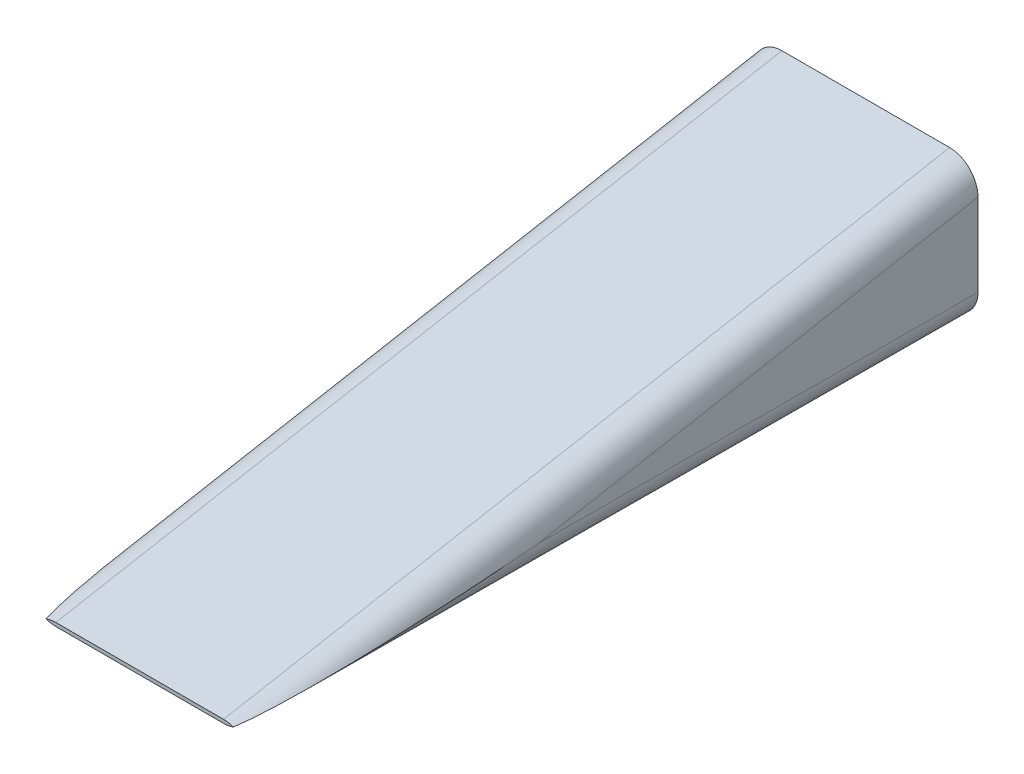
ISO-10303-21;
HEADER;
FILE_DESCRIPTION(('STEP AP214'),'2;1');
FILE_NAME('part.step','',(''),(''),'','','');
FILE_SCHEMA(('AUTOMOTIVE_DESIGN { 1 0 10303 214 1 1 1 1 }'));
ENDSEC;
DATA;
#1=APPLICATION_CONTEXT('core data for automotive mechanical design processes');
#2=APPLICATION_PROTOCOL_DEFINITION('international standard','automotive_design',2000,#1);
#3=PRODUCT_CONTEXT('',#1,'mechanical');
#4=PRODUCT('Part','Part','',(#3));
#5=PRODUCT_RELATED_PRODUCT_CATEGORY('part','',(#4));
#6=PRODUCT_DEFINITION_FORMATION('','',#4);
#7=PRODUCT_DEFINITION_CONTEXT('part definition',#1,'design');
#8=PRODUCT_DEFINITION('design','',#6,#7);
#9=PRODUCT_DEFINITION_SHAPE('','',#8);
#10=(LENGTH_UNIT() NAMED_UNIT(*) SI_UNIT(.MILLI.,.METRE.));
#11=(NAMED_UNIT(*) PLANE_ANGLE_UNIT() SI_UNIT($,.RADIAN.));
#12=(NAMED_UNIT(*) SI_UNIT($,.STERADIAN.) SOLID_ANGLE_UNIT());
#13=UNCERTAINTY_MEASURE_WITH_UNIT(LENGTH_MEASURE(1.E-05),#10,'distance_accuracy_value','');
#14=(GEOMETRIC_REPRESENTATION_CONTEXT(3) GLOBAL_UNCERTAINTY_ASSIGNED_CONTEXT((#13)) GLOBAL_UNIT_ASSIGNED_CONTEXT((#10,
#11,#12)) REPRESENTATION_CONTEXT('',''));
#15=CARTESIAN_POINT('',(0.,0.,0.));
#16=DIRECTION('',(0.,0.,1.));
#17=DIRECTION('',(1.,0.,0.));
#18=AXIS2_PLACEMENT_3D('',#15,#16,#17);
#19=CARTESIAN_POINT('',(-20.1168,-12.5095,0.));
#20=DIRECTION('',(0.,0.,-1.));
#21=DIRECTION('',(-1.,0.,0.));
#22=AXIS2_PLACEMENT_3D('',#19,#20,#21);
#23=PLANE('',#22);
#24=DIRECTION('',(0.,1.,0.));
#25=VECTOR('',#24,1.);
#26=CARTESIAN_POINT('',(20.1168,12.5095,0.));
#27=LINE('',#26,#25);
#28=CARTESIAN_POINT('',(20.1168,-7.42942686786728,0.));
#29=VERTEX_POINT('',#28);
#30=CARTESIAN_POINT('',(20.1168,7.34609482182045,0.));
#31=VERTEX_POINT('',#30);
#32=EDGE_CURVE('E256',#29,#31,#27,.T.);
#33=ORIENTED_EDGE('',*,*,#32,.F.);
#34=CARTESIAN_POINT('',(15.0368,-7.42942686786727,0.));
#35=DIRECTION('',(0.,0.,-1.));
#36=DIRECTION('',(0.,1.,0.));
#37=AXIS2_PLACEMENT_3D('',#34,#35,#36);
#38=ELLIPSE('',#37,5.08007313213272,5.08);
#39=CARTESIAN_POINT('',(15.0368,-12.5095,0.));
#40=VERTEX_POINT('',#39);
#41=EDGE_CURVE('E304',#29,#40,#38,.T.);
#42=ORIENTED_EDGE('',*,*,#41,.T.);
#43=DIRECTION('',(1.,0.,0.));
#44=VECTOR('',#43,1.);
#45=CARTESIAN_POINT('',(20.1168,-12.5095,0.));
#46=LINE('',#45,#44);
#47=CARTESIAN_POINT('',(-15.0368,-12.5095,0.));
#48=VERTEX_POINT('',#47);
#49=EDGE_CURVE('E254',#48,#40,#46,.T.);
#50=ORIENTED_EDGE('',*,*,#49,.F.);
#51=CARTESIAN_POINT('',(-15.0368,-7.42942686786728,0.));
#52=DIRECTION('',(0.,0.,-1.));
#53=DIRECTION('',(0.,1.,0.));
#54=AXIS2_PLACEMENT_3D('',#51,#52,#53);
#55=ELLIPSE('',#54,5.08007313213272,5.08);
#56=CARTESIAN_POINT('',(-20.1168,-7.42942686786728,0.));
#57=VERTEX_POINT('',#56);
#58=EDGE_CURVE('E300',#48,#57,#55,.T.);
#59=ORIENTED_EDGE('',*,*,#58,.T.);
#60=DIRECTION('',(0.,-1.,0.));
#61=VECTOR('',#60,1.);
#62=CARTESIAN_POINT('',(-20.1168,12.5095,0.));
#63=LINE('',#62,#61);
#64=CARTESIAN_POINT('',(-20.1168,7.34609482182047,0.));
#65=VERTEX_POINT('',#64);
#66=EDGE_CURVE('E47',#65,#57,#63,.T.);
#67=ORIENTED_EDGE('',*,*,#66,.F.);
#68=CARTESIAN_POINT('',(-15.0368,7.34609482182047,0.));
#69=DIRECTION('',(0.,0.,-1.));
#70=DIRECTION('',(0.,-1.,0.));
#71=AXIS2_PLACEMENT_3D('',#68,#69,#70);
#72=ELLIPSE('',#71,5.16340517817953,5.08);
#73=CARTESIAN_POINT('',(-15.0368,12.5095,0.));
#74=VERTEX_POINT('',#73);
#75=EDGE_CURVE('E69',#65,#74,#72,.T.);
#76=ORIENTED_EDGE('',*,*,#75,.T.);
#77=DIRECTION('',(-1.,0.,0.));
#78=VECTOR('',#77,1.);
#79=CARTESIAN_POINT('',(20.1168,12.5095,0.));
#80=LINE('',#79,#78);
#81=CARTESIAN_POINT('',(15.0368,12.5095,0.));
#82=VERTEX_POINT('',#81);
#83=EDGE_CURVE('E291',#82,#74,#80,.T.);
#84=ORIENTED_EDGE('',*,*,#83,.F.);
#85=CARTESIAN_POINT('',(15.0368,7.34609482182045,0.));
#86=DIRECTION('',(0.,0.,-1.));
#87=DIRECTION('',(0.,-1.,0.));
#88=AXIS2_PLACEMENT_3D('',#85,#86,#87);
#89=ELLIPSE('',#88,5.16340517817953,5.08);
#90=EDGE_CURVE('E295',#82,#31,#89,.T.);
#91=ORIENTED_EDGE('',*,*,#90,.T.);
#92=EDGE_LOOP('',(#33,#42,#50,#59,#67,#76,#84,#91));
#93=FACE_BOUND('',#92,.T.);
#94=DIRECTION('',(-1.,0.,0.));
#95=VECTOR('',#94,1.);
#96=CARTESIAN_POINT('',(-20.1168,9.38563986720139,0.));
#97=LINE('',#96,#95);
#98=CARTESIAN_POINT('',(17.0434,9.38563986720137,0.));
#99=VERTEX_POINT('',#98);
#100=CARTESIAN_POINT('',(-17.0434,9.38563986720139,0.));
#101=VERTEX_POINT('',#100);
#102=EDGE_CURVE('E152',#99,#101,#97,.T.);
#103=ORIENTED_EDGE('',*,*,#102,.T.);
#104=DIRECTION('',(0.,-1.,0.));
#105=VECTOR('',#104,1.);
#106=CARTESIAN_POINT('',(-17.0434,-11.811,0.));
#107=LINE('',#106,#105);
#108=CARTESIAN_POINT('',(-17.0434,-9.4360557550597,0.));
#109=VERTEX_POINT('',#108);
#110=EDGE_CURVE('E143',#101,#109,#107,.T.);
#111=ORIENTED_EDGE('',*,*,#110,.T.);
#112=DIRECTION('',(1.,0.,0.));
#113=VECTOR('',#112,1.);
#114=CARTESIAN_POINT('',(20.1168,-9.4360557550597,0.));
#115=LINE('',#114,#113);
#116=CARTESIAN_POINT('',(17.0434,-9.4360557550597,0.));
#117=VERTEX_POINT('',#116);
#118=EDGE_CURVE('E133',#109,#117,#115,.T.);
#119=ORIENTED_EDGE('',*,*,#118,.T.);
#120=DIRECTION('',(0.,1.,0.));
#121=VECTOR('',#120,1.);
#122=CARTESIAN_POINT('',(17.0434,-11.176,0.));
#123=LINE('',#122,#121);
#124=EDGE_CURVE('E142',#117,#99,#123,.T.);
#125=ORIENTED_EDGE('',*,*,#124,.T.);
#126=EDGE_LOOP('',(#103,#111,#119,#125));
#127=FACE_BOUND('',#126,.T.);
#128=ADVANCED_FACE('F43',(#93,#127),#23,.T.);
#129=CARTESIAN_POINT('',(-20.1168,-11.176,130.175));
#130=DIRECTION('',(0.,0.,-1.));
#131=DIRECTION('',(-1.,0.,0.));
#132=AXIS2_PLACEMENT_3D('',#129,#130,#131);
#133=PLANE('',#132);
#134=DIRECTION('',(-1.,0.,0.));
#135=VECTOR('',#134,1.);
#136=CARTESIAN_POINT('',(-20.1168,-11.811,130.175));
#137=LINE('',#136,#135);
#138=CARTESIAN_POINT('',(15.0368,-11.811,130.175));
#139=VERTEX_POINT('',#138);
#140=CARTESIAN_POINT('',(-15.0368,-11.811,130.175));
#141=VERTEX_POINT('',#140);
#142=EDGE_CURVE('E232',#139,#141,#137,.T.);
#143=ORIENTED_EDGE('',*,*,#142,.F.);
#144=CARTESIAN_POINT('',(15.0368,-6.73092686786729,130.175));
#145=DIRECTION('',(0.,0.,-1.));
#146=DIRECTION('',(0.,1.,0.));
#147=AXIS2_PLACEMENT_3D('',#144,#145,#146);
#148=ELLIPSE('',#147,5.08007313213272,5.08);
#149=CARTESIAN_POINT('',(16.7975787225025,-11.4960829043435,130.175));
#150=VERTEX_POINT('',#149);
#151=EDGE_CURVE('E353',#139,#150,#148,.F.);
#152=ORIENTED_EDGE('',*,*,#151,.T.);
#153=CARTESIAN_POINT('',(15.0368,-16.3394051781795,130.175));
#154=DIRECTION('',(0.,0.,-1.));
#155=DIRECTION('',(0.,-1.,0.));
#156=AXIS2_PLACEMENT_3D('',#153,#154,#155);
#157=ELLIPSE('',#156,5.16340517817953,5.08);
#158=CARTESIAN_POINT('',(15.0368,-11.176,130.175));
#159=VERTEX_POINT('',#158);
#160=EDGE_CURVE('E375',#150,#159,#157,.F.);
#161=ORIENTED_EDGE('',*,*,#160,.T.);
#162=DIRECTION('',(1.,0.,0.));
#163=VECTOR('',#162,1.);
#164=CARTESIAN_POINT('',(-20.1168,-11.176,130.175));
#165=LINE('',#164,#163);
#166=CARTESIAN_POINT('',(-15.0368,-11.176,130.175));
#167=VERTEX_POINT('',#166);
#168=EDGE_CURVE('E160',#167,#159,#165,.T.);
#169=ORIENTED_EDGE('',*,*,#168,.F.);
#170=CARTESIAN_POINT('',(-15.0368,-16.3394051781795,130.175));
#171=DIRECTION('',(0.,0.,-1.));
#172=DIRECTION('',(0.,-1.,0.));
#173=AXIS2_PLACEMENT_3D('',#170,#171,#172);
#174=ELLIPSE('',#173,5.16340517817953,5.08);
#175=CARTESIAN_POINT('',(-16.7975787225026,-11.4960829043435,130.175));
#176=VERTEX_POINT('',#175);
#177=EDGE_CURVE('E214',#167,#176,#174,.F.);
#178=ORIENTED_EDGE('',*,*,#177,.T.);
#179=CARTESIAN_POINT('',(-15.0368,-6.73092686786729,130.175));
#180=DIRECTION('',(0.,0.,-1.));
#181=DIRECTION('',(0.,1.,0.));
#182=AXIS2_PLACEMENT_3D('',#179,#180,#181);
#183=ELLIPSE('',#182,5.08007313213272,5.08);
#184=EDGE_CURVE('E379',#176,#141,#183,.F.);
#185=ORIENTED_EDGE('',*,*,#184,.T.);
#186=EDGE_LOOP('',(#143,#152,#161,#169,#178,#185));
#187=FACE_BOUND('',#186,.T.);
#188=ADVANCED_FACE('F182',(#187),#133,.F.);
#189=CARTESIAN_POINT('',(20.1168,-11.811,130.175));
#190=DIRECTION('',(0.,-0.999985604118126,0.00536577641234105));
#191=DIRECTION('',(0.,-0.00536577641234105,-0.999985604118126));
#192=AXIS2_PLACEMENT_3D('',#189,#190,#191);
#193=PLANE('',#192);
#194=ORIENTED_EDGE('',*,*,#49,.T.);
#195=DIRECTION('',(0.,0.00536577641234105,0.999985604118126));
#196=VECTOR('',#195,1.);
#197=CARTESIAN_POINT('',(15.0368,-11.811,130.175));
#198=LINE('',#197,#196);
#199=EDGE_CURVE('E331',#40,#139,#198,.T.);
#200=ORIENTED_EDGE('',*,*,#199,.T.);
#201=ORIENTED_EDGE('',*,*,#142,.T.);
#202=DIRECTION('',(0.,0.00536577641234105,0.999985604118126));
#203=VECTOR('',#202,1.);
#204=CARTESIAN_POINT('',(-15.0368,-11.811,130.175));
#205=LINE('',#204,#203);
#206=EDGE_CURVE('E329',#141,#48,#205,.F.);
#207=ORIENTED_EDGE('',*,*,#206,.T.);
#208=EDGE_LOOP('',(#194,#200,#201,#207));
#209=FACE_BOUND('',#208,.T.);
#210=ADVANCED_FACE('F274',(#209),#193,.T.);
#211=CARTESIAN_POINT('',(-20.1168,-11.811,130.175));
#212=DIRECTION('',(-1.,0.,0.));
#213=DIRECTION('',(0.,0.,1.));
#214=AXIS2_PLACEMENT_3D('',#211,#212,#213);
#215=PLANE('',#214);
#216=ORIENTED_EDGE('',*,*,#66,.T.);
#217=DIRECTION('',(0.,0.00536577641234105,0.999985604118126));
#218=VECTOR('',#217,1.);
#219=CARTESIAN_POINT('',(-20.1168,-6.73107313107994,130.147741855825));
#220=LINE('',#219,#218);
#221=CARTESIAN_POINT('',(-20.1168,-7.00616973613143,78.8797381871351));
#222=VERTEX_POINT('',#221);
#223=EDGE_CURVE('E312',#57,#222,#220,.T.);
#224=ORIENTED_EDGE('',*,*,#223,.T.);
#225=DIRECTION('',(0.,-0.179012136995965,0.983846865527424));
#226=VECTOR('',#225,1.);
#227=CARTESIAN_POINT('',(-20.1168,-16.1942908710761,129.377454880531));
#228=LINE('',#227,#226);
#229=EDGE_CURVE('E308',#222,#65,#228,.F.);
#230=ORIENTED_EDGE('',*,*,#229,.T.);
#231=EDGE_LOOP('',(#216,#224,#230));
#232=FACE_BOUND('',#231,.T.);
#233=ADVANCED_FACE('F343',(#232),#215,.T.);
#234=CARTESIAN_POINT('',(20.1168,-11.176,130.175));
#235=DIRECTION('',(1.,0.,0.));
#236=DIRECTION('',(0.,0.,-1.));
#237=AXIS2_PLACEMENT_3D('',#234,#235,#236);
#238=PLANE('',#237);
#239=DIRECTION('',(0.,-0.179012136995965,0.983846865527424));
#240=VECTOR('',#239,1.);
#241=CARTESIAN_POINT('',(20.1168,-16.1739420768793,129.26561834406));
#242=LINE('',#241,#240);
#243=CARTESIAN_POINT('',(20.1168,-7.00616973613143,78.879738187135));
#244=VERTEX_POINT('',#243);
#245=EDGE_CURVE('E349',#31,#244,#242,.T.);
#246=ORIENTED_EDGE('',*,*,#245,.T.);
#247=DIRECTION('',(0.,0.00536577641234105,0.999985604118126));
#248=VECTOR('',#247,1.);
#249=CARTESIAN_POINT('',(20.1168,-6.73105484844155,130.151149074797));
#250=LINE('',#249,#248);
#251=EDGE_CURVE('E296',#244,#29,#250,.F.);
#252=ORIENTED_EDGE('',*,*,#251,.T.);
#253=ORIENTED_EDGE('',*,*,#32,.T.);
#254=EDGE_LOOP('',(#246,#252,#253));
#255=FACE_BOUND('',#254,.T.);
#256=ADVANCED_FACE('F180',(#255),#238,.T.);
#257=CARTESIAN_POINT('',(-20.1168,-11.176,130.175));
#258=DIRECTION('',(0.,0.983846865527424,0.179012136995965));
#259=DIRECTION('',(0.,-0.179012136995965,0.983846865527424));
#260=AXIS2_PLACEMENT_3D('',#257,#258,#259);
#261=PLANE('',#260);
#262=ORIENTED_EDGE('',*,*,#168,.T.);
#263=DIRECTION('',(0.,-0.179012136995965,0.983846865527424));
#264=VECTOR('',#263,1.);
#265=CARTESIAN_POINT('',(15.0368,-11.176,130.175));
#266=LINE('',#265,#264);
#267=EDGE_CURVE('E12',#159,#82,#266,.F.);
#268=ORIENTED_EDGE('',*,*,#267,.T.);
#269=ORIENTED_EDGE('',*,*,#83,.T.);
#270=DIRECTION('',(0.,-0.179012136995965,0.983846865527424));
#271=VECTOR('',#270,1.);
#272=CARTESIAN_POINT('',(-15.0368,-11.176,130.175));
#273=LINE('',#272,#271);
#274=EDGE_CURVE('E53',#74,#167,#273,.T.);
#275=ORIENTED_EDGE('',*,*,#274,.T.);
#276=EDGE_LOOP('',(#262,#268,#269,#275));
#277=FACE_BOUND('',#276,.T.);
#278=ADVANCED_FACE('F170',(#277),#261,.T.);
#279=CARTESIAN_POINT('',(20.1168,-8.73764424430336,130.158508822774));
#280=DIRECTION('',(0.,-0.999985604118126,0.00536577641234105));
#281=DIRECTION('',(0.,-0.00536577641234105,-0.999985604118126));
#282=AXIS2_PLACEMENT_3D('',#279,#280,#281);
#283=PLANE('',#282);
#284=DIRECTION('',(0.,0.00536577641234105,0.999985604118126));
#285=VECTOR('',#284,1.);
#286=CARTESIAN_POINT('',(17.0434,-8.73764424430336,130.158508822774));
#287=LINE('',#286,#285);
#288=CARTESIAN_POINT('',(17.0434,-8.89689259921369,100.480406316758));
#289=VERTEX_POINT('',#288);
#290=EDGE_CURVE('E138',#117,#289,#287,.T.);
#291=ORIENTED_EDGE('',*,*,#290,.F.);
#292=ORIENTED_EDGE('',*,*,#118,.F.);
#293=DIRECTION('',(0.,0.00536577641234105,0.999985604118126));
#294=VECTOR('',#293,1.);
#295=CARTESIAN_POINT('',(-17.0434,-8.73764424430336,130.158508822774));
#296=LINE('',#295,#294);
#297=CARTESIAN_POINT('',(-17.0434,-8.89689259921369,100.480406316759));
#298=VERTEX_POINT('',#297);
#299=EDGE_CURVE('E136',#109,#298,#296,.T.);
#300=ORIENTED_EDGE('',*,*,#299,.T.);
#301=DIRECTION('',(-1.,0.,0.));
#302=VECTOR('',#301,1.);
#303=CARTESIAN_POINT('',(20.1167999999999,-8.89689259921369,100.480406316758));
#304=LINE('',#303,#302);
#305=EDGE_CURVE('E157',#289,#298,#304,.T.);
#306=ORIENTED_EDGE('',*,*,#305,.F.);
#307=EDGE_LOOP('',(#291,#292,#300,#306));
#308=FACE_BOUND('',#307,.T.);
#309=ADVANCED_FACE('F135',(#308),#283,.F.);
#310=CARTESIAN_POINT('',(-17.0434,-11.811,130.175));
#311=DIRECTION('',(-1.,0.,0.));
#312=DIRECTION('',(0.,0.,1.));
#313=AXIS2_PLACEMENT_3D('',#310,#311,#312);
#314=PLANE('',#313);
#315=ORIENTED_EDGE('',*,*,#299,.F.);
#316=ORIENTED_EDGE('',*,*,#110,.F.);
#317=DIRECTION('',(0.,-0.179012136995965,0.983846865527424));
#318=VECTOR('',#317,1.);
#319=CARTESIAN_POINT('',(-17.0434,-14.199754956512,129.624824098157));
#320=LINE('',#319,#318);
#321=EDGE_CURVE('E150',#101,#298,#320,.T.);
#322=ORIENTED_EDGE('',*,*,#321,.T.);
#323=EDGE_LOOP('',(#315,#316,#322));
#324=FACE_BOUND('',#323,.T.);
#325=ADVANCED_FACE('F148',(#324),#314,.F.);
#326=CARTESIAN_POINT('',(17.0434,-11.176,130.175));
#327=DIRECTION('',(1.,0.,0.));
#328=DIRECTION('',(0.,0.,-1.));
#329=AXIS2_PLACEMENT_3D('',#326,#327,#328);
#330=PLANE('',#329);
#331=DIRECTION('',(0.,-0.179012136995965,0.983846865527424));
#332=VECTOR('',#331,1.);
#333=CARTESIAN_POINT('',(17.0434,-14.199754956512,129.624824098157));
#334=LINE('',#333,#332);
#335=EDGE_CURVE('E413',#99,#289,#334,.T.);
#336=ORIENTED_EDGE('',*,*,#335,.F.);
#337=ORIENTED_EDGE('',*,*,#124,.F.);
#338=ORIENTED_EDGE('',*,*,#290,.T.);
#339=EDGE_LOOP('',(#336,#337,#338));
#340=FACE_BOUND('',#339,.T.);
#341=ADVANCED_FACE('F405',(#340),#330,.F.);
#342=CARTESIAN_POINT('',(-20.1168,-14.199754956512,129.624824098157));
#343=DIRECTION('',(0.,0.983846865527424,0.179012136995965));
#344=DIRECTION('',(0.,-0.179012136995965,0.983846865527424));
#345=AXIS2_PLACEMENT_3D('',#342,#343,#344);
#346=PLANE('',#345);
#347=ORIENTED_EDGE('',*,*,#305,.T.);
#348=ORIENTED_EDGE('',*,*,#321,.F.);
#349=ORIENTED_EDGE('',*,*,#102,.F.);
#350=ORIENTED_EDGE('',*,*,#335,.T.);
#351=EDGE_LOOP('',(#347,#348,#349,#350));
#352=FACE_BOUND('',#351,.T.);
#353=ADVANCED_FACE('F272',(#352),#346,.F.);
#354=CARTESIAN_POINT('',(15.0368,-16.1739420768793,129.26561834406));
#355=DIRECTION('',(0.,-0.179012136995965,0.983846865527424));
#356=DIRECTION('',(0.,-0.983846865527424,-0.179012136995965));
#357=AXIS2_PLACEMENT_3D('',#354,#355,#356);
#358=CYLINDRICAL_SURFACE('',#357,5.08);
#359=ORIENTED_EDGE('',*,*,#267,.F.);
#360=ORIENTED_EDGE('',*,*,#160,.F.);
#361=CARTESIAN_POINT('',(15.0368,-7.00616973613143,78.8797381871351));
#362=DIRECTION('',(0.,0.996191056295524,0.0871973586572962));
#363=DIRECTION('',(0.,-0.0871973586572969,0.996191056295523));
#364=AXIS2_PLACEMENT_3D('',#361,#362,#363);
#365=ELLIPSE('',#364,54.8943251654489,5.08);
#366=EDGE_CURVE('E324',#244,#150,#365,.F.);
#367=ORIENTED_EDGE('',*,*,#366,.F.);
#368=ORIENTED_EDGE('',*,*,#245,.F.);
#369=ORIENTED_EDGE('',*,*,#90,.F.);
#370=EDGE_LOOP('',(#359,#360,#367,#368,#369));
#371=FACE_BOUND('',#370,.T.);
#372=ADVANCED_FACE('F390',(#371),#358,.T.);
#373=CARTESIAN_POINT('',(15.0368,-6.73107313107993,130.147741855825));
#374=DIRECTION('',(0.,0.00536577641234105,0.999985604118126));
#375=DIRECTION('',(0.,-0.999985604118126,0.00536577641234105));
#376=AXIS2_PLACEMENT_3D('',#373,#374,#375);
#377=CYLINDRICAL_SURFACE('',#376,5.08);
#378=ORIENTED_EDGE('',*,*,#41,.F.);
#379=ORIENTED_EDGE('',*,*,#251,.F.);
#380=ORIENTED_EDGE('',*,*,#366,.T.);
#381=ORIENTED_EDGE('',*,*,#151,.F.);
#382=ORIENTED_EDGE('',*,*,#199,.F.);
#383=EDGE_LOOP('',(#378,#379,#380,#381,#382));
#384=FACE_BOUND('',#383,.T.);
#385=ADVANCED_FACE('F385',(#384),#377,.T.);
#386=CARTESIAN_POINT('',(-15.0368,-16.1739420768793,129.26561834406));
#387=DIRECTION('',(0.,-0.179012136995965,0.983846865527424));
#388=DIRECTION('',(0.,-0.983846865527424,-0.179012136995965));
#389=AXIS2_PLACEMENT_3D('',#386,#387,#388);
#390=CYLINDRICAL_SURFACE('',#389,5.08);
#391=ORIENTED_EDGE('',*,*,#75,.F.);
#392=ORIENTED_EDGE('',*,*,#229,.F.);
#393=CARTESIAN_POINT('',(-15.0368,-7.00616973613144,78.8797381871352));
#394=DIRECTION('',(0.,-0.996191056295524,-0.0871973586572962));
#395=DIRECTION('',(0.,-0.0871973586572969,0.996191056295523));
#396=AXIS2_PLACEMENT_3D('',#393,#394,#395);
#397=ELLIPSE('',#396,54.8943251654489,5.08);
#398=EDGE_CURVE('E61',#176,#222,#397,.T.);
#399=ORIENTED_EDGE('',*,*,#398,.F.);
#400=ORIENTED_EDGE('',*,*,#177,.F.);
#401=ORIENTED_EDGE('',*,*,#274,.F.);
#402=EDGE_LOOP('',(#391,#392,#399,#400,#401));
#403=FACE_BOUND('',#402,.T.);
#404=ADVANCED_FACE('F45',(#403),#390,.T.);
#405=CARTESIAN_POINT('',(-15.0368,-6.73107313107993,130.147741855825));
#406=DIRECTION('',(0.,0.00536577641234105,0.999985604118126));
#407=DIRECTION('',(0.,-0.999985604118126,0.00536577641234105));
#408=AXIS2_PLACEMENT_3D('',#405,#406,#407);
#409=CYLINDRICAL_SURFACE('',#408,5.08);
#410=ORIENTED_EDGE('',*,*,#58,.F.);
#411=ORIENTED_EDGE('',*,*,#206,.F.);
#412=ORIENTED_EDGE('',*,*,#184,.F.);
#413=ORIENTED_EDGE('',*,*,#398,.T.);
#414=ORIENTED_EDGE('',*,*,#223,.F.);
#415=EDGE_LOOP('',(#410,#411,#412,#413,#414));
#416=FACE_BOUND('',#415,.T.);
#417=ADVANCED_FACE('F341',(#416),#409,.T.);
#418=CLOSED_SHELL('',(#128,#188,#210,#233,#256,#278,#309,#325,#341,#353,#372,#385,#404,#417));
#419=MANIFOLD_SOLID_BREP('B2',#418);
#420=ADVANCED_BREP_SHAPE_REPRESENTATION('',(#18,#419),#14);
#421=SHAPE_DEFINITION_REPRESENTATION(#9,#420);
ENDSEC;
END-ISO-10303-21;
